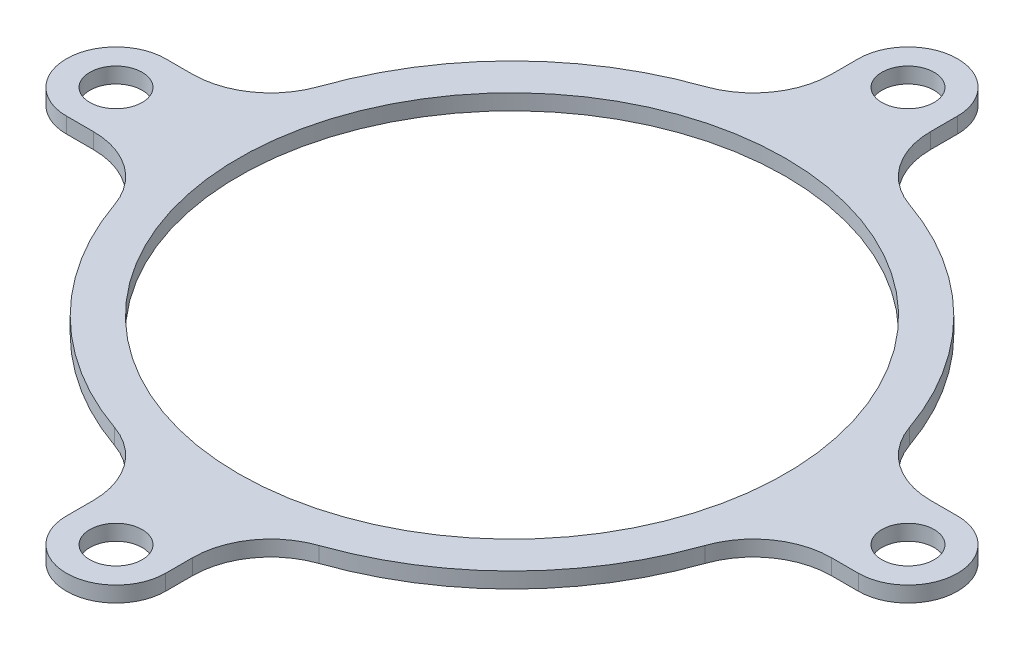
ISO-10303-21;
HEADER;
FILE_DESCRIPTION(('STEP AP214'),'2;1');
FILE_NAME('part.step','',(''),(''),'','','');
FILE_SCHEMA(('AUTOMOTIVE_DESIGN { 1 0 10303 214 1 1 1 1 }'));
ENDSEC;
DATA;
#1=APPLICATION_CONTEXT('core data for automotive mechanical design processes');
#2=APPLICATION_PROTOCOL_DEFINITION('international standard','automotive_design',2000,#1);
#3=PRODUCT_CONTEXT('',#1,'mechanical');
#4=PRODUCT('Part','Part','',(#3));
#5=PRODUCT_RELATED_PRODUCT_CATEGORY('part','',(#4));
#6=PRODUCT_DEFINITION_FORMATION('','',#4);
#7=PRODUCT_DEFINITION_CONTEXT('part definition',#1,'design');
#8=PRODUCT_DEFINITION('design','',#6,#7);
#9=PRODUCT_DEFINITION_SHAPE('','',#8);
#10=(LENGTH_UNIT() NAMED_UNIT(*) SI_UNIT(.MILLI.,.METRE.));
#11=(NAMED_UNIT(*) PLANE_ANGLE_UNIT() SI_UNIT($,.RADIAN.));
#12=(NAMED_UNIT(*) SI_UNIT($,.STERADIAN.) SOLID_ANGLE_UNIT());
#13=UNCERTAINTY_MEASURE_WITH_UNIT(LENGTH_MEASURE(1.E-05),#10,'distance_accuracy_value','');
#14=(GEOMETRIC_REPRESENTATION_CONTEXT(3) GLOBAL_UNCERTAINTY_ASSIGNED_CONTEXT((#13)) GLOBAL_UNIT_ASSIGNED_CONTEXT((#10,
#11,#12)) REPRESENTATION_CONTEXT('',''));
#15=CARTESIAN_POINT('',(0.,0.,0.));
#16=DIRECTION('',(0.,0.,1.));
#17=DIRECTION('',(1.,0.,0.));
#18=AXIS2_PLACEMENT_3D('',#15,#16,#17);
#19=CARTESIAN_POINT('',(0.,1.,0.));
#20=DIRECTION('',(0.,-1.,0.));
#21=DIRECTION('',(0.,0.,-1.));
#22=AXIS2_PLACEMENT_3D('',#19,#20,#21);
#23=CYLINDRICAL_SURFACE('',#22,40.);
#24=DIRECTION('',(0.,1.,0.));
#25=VECTOR('',#24,1.);
#26=CARTESIAN_POINT('',(37.8009735324368,-33.4787718355997,-13.0800000000004));
#27=LINE('',#26,#25);
#28=CARTESIAN_POINT('',(37.8009735324368,-1.,-13.0800000000004));
#29=VERTEX_POINT('',#28);
#30=CARTESIAN_POINT('',(37.8009735324368,1.,-13.0800000000004));
#31=VERTEX_POINT('',#30);
#32=EDGE_CURVE('E236',#29,#31,#27,.T.);
#33=ORIENTED_EDGE('',*,*,#32,.F.);
#34=CARTESIAN_POINT('',(0.,-1.,0.));
#35=DIRECTION('',(0.,1.,0.));
#36=DIRECTION('',(0.,0.,1.));
#37=AXIS2_PLACEMENT_3D('',#34,#35,#36);
#38=CIRCLE('',#37,40.);
#39=CARTESIAN_POINT('',(13.08,-1.,-37.800973532437));
#40=VERTEX_POINT('',#39);
#41=EDGE_CURVE('E386',#29,#40,#38,.T.);
#42=ORIENTED_EDGE('',*,*,#41,.T.);
#43=DIRECTION('',(0.,1.,0.));
#44=VECTOR('',#43,1.);
#45=CARTESIAN_POINT('',(13.08,-33.4787718355997,-37.800973532437));
#46=LINE('',#45,#44);
#47=CARTESIAN_POINT('',(13.08,1.,-37.800973532437));
#48=VERTEX_POINT('',#47);
#49=EDGE_CURVE('E376',#40,#48,#46,.T.);
#50=ORIENTED_EDGE('',*,*,#49,.T.);
#51=CARTESIAN_POINT('',(0.,1.,0.));
#52=DIRECTION('',(0.,1.,0.));
#53=DIRECTION('',(0.,0.,1.));
#54=AXIS2_PLACEMENT_3D('',#51,#52,#53);
#55=CIRCLE('',#54,40.);
#56=EDGE_CURVE('E47',#31,#48,#55,.T.);
#57=ORIENTED_EDGE('',*,*,#56,.F.);
#58=EDGE_LOOP('',(#33,#42,#50,#57));
#59=FACE_BOUND('',#58,.T.);
#60=ADVANCED_FACE('F37',(#59),#23,.T.);
#61=CARTESIAN_POINT('',(13.08,-1.,37.800973532437));
#62=VERTEX_POINT('',#61);
#63=CARTESIAN_POINT('',(37.8009735324371,-1.,13.0799999999996));
#64=VERTEX_POINT('',#63);
#65=EDGE_CURVE('E444',#62,#64,#38,.T.);
#66=ORIENTED_EDGE('',*,*,#65,.T.);
#67=DIRECTION('',(0.,1.,0.));
#68=VECTOR('',#67,1.);
#69=CARTESIAN_POINT('',(37.8009735324371,-33.4787718355997,13.0799999999996));
#70=LINE('',#69,#68);
#71=CARTESIAN_POINT('',(37.8009735324371,1.,13.0799999999996));
#72=VERTEX_POINT('',#71);
#73=EDGE_CURVE('E61',#64,#72,#70,.T.);
#74=ORIENTED_EDGE('',*,*,#73,.T.);
#75=CARTESIAN_POINT('',(13.08,1.,37.800973532437));
#76=VERTEX_POINT('',#75);
#77=EDGE_CURVE('E224',#76,#72,#55,.T.);
#78=ORIENTED_EDGE('',*,*,#77,.F.);
#79=DIRECTION('',(0.,1.,0.));
#80=VECTOR('',#79,1.);
#81=CARTESIAN_POINT('',(13.08,-33.4787718355997,37.800973532437));
#82=LINE('',#81,#80);
#83=EDGE_CURVE('E278',#62,#76,#82,.T.);
#84=ORIENTED_EDGE('',*,*,#83,.F.);
#85=EDGE_LOOP('',(#66,#74,#78,#84));
#86=FACE_BOUND('',#85,.T.);
#87=ADVANCED_FACE('F410',(#86),#23,.T.);
#88=CARTESIAN_POINT('',(-37.8009735324369,-1.,13.0800000000001));
#89=VERTEX_POINT('',#88);
#90=CARTESIAN_POINT('',(-13.08,-1.,37.800973532437));
#91=VERTEX_POINT('',#90);
#92=EDGE_CURVE('E440',#89,#91,#38,.T.);
#93=ORIENTED_EDGE('',*,*,#92,.T.);
#94=DIRECTION('',(0.,1.,0.));
#95=VECTOR('',#94,1.);
#96=CARTESIAN_POINT('',(-13.08,-33.4787718355997,37.800973532437));
#97=LINE('',#96,#95);
#98=CARTESIAN_POINT('',(-13.08,1.,37.800973532437));
#99=VERTEX_POINT('',#98);
#100=EDGE_CURVE('E286',#91,#99,#97,.T.);
#101=ORIENTED_EDGE('',*,*,#100,.T.);
#102=CARTESIAN_POINT('',(-37.8009735324369,1.,13.0800000000001));
#103=VERTEX_POINT('',#102);
#104=EDGE_CURVE('E46',#103,#99,#55,.T.);
#105=ORIENTED_EDGE('',*,*,#104,.F.);
#106=DIRECTION('',(0.,1.,0.));
#107=VECTOR('',#106,1.);
#108=CARTESIAN_POINT('',(-37.8009735324369,-33.4787718355997,13.0800000000001));
#109=LINE('',#108,#107);
#110=EDGE_CURVE('E323',#89,#103,#109,.T.);
#111=ORIENTED_EDGE('',*,*,#110,.F.);
#112=EDGE_LOOP('',(#93,#101,#105,#111));
#113=FACE_BOUND('',#112,.T.);
#114=ADVANCED_FACE('F406',(#113),#23,.T.);
#115=CARTESIAN_POINT('',(0.,1.,0.));
#116=DIRECTION('',(0.,1.,0.));
#117=DIRECTION('',(0.,0.,1.));
#118=AXIS2_PLACEMENT_3D('',#115,#116,#117);
#119=PLANE('',#118);
#120=CARTESIAN_POINT('',(-13.08,1.,-37.800973532437));
#121=VERTEX_POINT('',#120);
#122=CARTESIAN_POINT('',(-37.800973532437,1.,-13.0799999999999));
#123=VERTEX_POINT('',#122);
#124=EDGE_CURVE('E11',#121,#123,#55,.T.);
#125=ORIENTED_EDGE('',*,*,#124,.T.);
#126=CARTESIAN_POINT('',(-47.2512169155463,1.,-16.3499999999998));
#127=DIRECTION('',(0.,-1.,0.));
#128=DIRECTION('',(1.,0.,0.));
#129=AXIS2_PLACEMENT_3D('',#126,#127,#128);
#130=CIRCLE('',#129,10.);
#131=CARTESIAN_POINT('',(-47.2512169155462,1.,-6.34999999999984));
#132=VERTEX_POINT('',#131);
#133=EDGE_CURVE('E311',#123,#132,#130,.T.);
#134=ORIENTED_EDGE('',*,*,#133,.T.);
#135=DIRECTION('',(-1.,0.,0.));
#136=VECTOR('',#135,1.);
#137=CARTESIAN_POINT('',(-50.7,1.,-6.34999999999982));
#138=LINE('',#137,#136);
#139=CARTESIAN_POINT('',(-50.7,1.,-6.34999999999982));
#140=VERTEX_POINT('',#139);
#141=EDGE_CURVE('E314',#132,#140,#138,.T.);
#142=ORIENTED_EDGE('',*,*,#141,.T.);
#143=CARTESIAN_POINT('',(-50.7,1.,1.77018103879347E-13));
#144=DIRECTION('',(0.,1.,0.));
#145=DIRECTION('',(-1.,0.,0.));
#146=AXIS2_PLACEMENT_3D('',#143,#144,#145);
#147=CIRCLE('',#146,6.35);
#148=CARTESIAN_POINT('',(-50.7,1.,6.35000000000018));
#149=VERTEX_POINT('',#148);
#150=EDGE_CURVE('E317',#140,#149,#147,.T.);
#151=ORIENTED_EDGE('',*,*,#150,.T.);
#152=DIRECTION('',(1.,0.,0.));
#153=VECTOR('',#152,1.);
#154=CARTESIAN_POINT('',(-47.2512169155462,1.,6.35000000000016));
#155=LINE('',#154,#153);
#156=CARTESIAN_POINT('',(-47.2512169155462,1.,6.35000000000016));
#157=VERTEX_POINT('',#156);
#158=EDGE_CURVE('E320',#149,#157,#155,.T.);
#159=ORIENTED_EDGE('',*,*,#158,.T.);
#160=CARTESIAN_POINT('',(-47.2512169155462,1.,16.3500000000002));
#161=DIRECTION('',(0.,-1.,0.));
#162=DIRECTION('',(-1.,0.,0.));
#163=AXIS2_PLACEMENT_3D('',#160,#161,#162);
#164=CIRCLE('',#163,10.);
#165=EDGE_CURVE('E308',#157,#103,#164,.T.);
#166=ORIENTED_EDGE('',*,*,#165,.T.);
#167=ORIENTED_EDGE('',*,*,#104,.T.);
#168=CARTESIAN_POINT('',(-16.35,1.,47.2512169155462));
#169=DIRECTION('',(0.,-1.,0.));
#170=DIRECTION('',(0.,0.,-1.));
#171=AXIS2_PLACEMENT_3D('',#168,#169,#170);
#172=CIRCLE('',#171,10.);
#173=CARTESIAN_POINT('',(-6.35,1.,47.2512169155462));
#174=VERTEX_POINT('',#173);
#175=EDGE_CURVE('E266',#99,#174,#172,.T.);
#176=ORIENTED_EDGE('',*,*,#175,.T.);
#177=DIRECTION('',(0.,0.,1.));
#178=VECTOR('',#177,1.);
#179=CARTESIAN_POINT('',(-6.35,1.,50.7));
#180=LINE('',#179,#178);
#181=CARTESIAN_POINT('',(-6.35,1.,50.7));
#182=VERTEX_POINT('',#181);
#183=EDGE_CURVE('E269',#174,#182,#180,.T.);
#184=ORIENTED_EDGE('',*,*,#183,.T.);
#185=CARTESIAN_POINT('',(0.,1.,50.7));
#186=DIRECTION('',(0.,1.,0.));
#187=DIRECTION('',(0.,0.,1.));
#188=AXIS2_PLACEMENT_3D('',#185,#186,#187);
#189=CIRCLE('',#188,6.35);
#190=CARTESIAN_POINT('',(6.35,1.,50.7));
#191=VERTEX_POINT('',#190);
#192=EDGE_CURVE('E272',#182,#191,#189,.T.);
#193=ORIENTED_EDGE('',*,*,#192,.T.);
#194=DIRECTION('',(0.,0.,-1.));
#195=VECTOR('',#194,1.);
#196=CARTESIAN_POINT('',(6.35,1.,47.2512169155462));
#197=LINE('',#196,#195);
#198=CARTESIAN_POINT('',(6.35,1.,47.2512169155462));
#199=VERTEX_POINT('',#198);
#200=EDGE_CURVE('E275',#191,#199,#197,.T.);
#201=ORIENTED_EDGE('',*,*,#200,.T.);
#202=CARTESIAN_POINT('',(16.35,1.,47.2512169155462));
#203=DIRECTION('',(0.,-1.,0.));
#204=DIRECTION('',(0.,0.,1.));
#205=AXIS2_PLACEMENT_3D('',#202,#203,#204);
#206=CIRCLE('',#205,10.);
#207=EDGE_CURVE('E264',#199,#76,#206,.T.);
#208=ORIENTED_EDGE('',*,*,#207,.T.);
#209=ORIENTED_EDGE('',*,*,#77,.T.);
#210=CARTESIAN_POINT('',(47.2512169155464,1.,16.3499999999995));
#211=DIRECTION('',(0.,-1.,0.));
#212=DIRECTION('',(-1.,0.,0.));
#213=AXIS2_PLACEMENT_3D('',#210,#211,#212);
#214=CIRCLE('',#213,10.);
#215=CARTESIAN_POINT('',(47.2512169155463,1.,6.3499999999995));
#216=VERTEX_POINT('',#215);
#217=EDGE_CURVE('E205',#72,#216,#214,.T.);
#218=ORIENTED_EDGE('',*,*,#217,.T.);
#219=DIRECTION('',(1.,0.,0.));
#220=VECTOR('',#219,1.);
#221=CARTESIAN_POINT('',(50.7000000000001,1.,6.34999999999947));
#222=LINE('',#221,#220);
#223=CARTESIAN_POINT('',(50.7000000000001,1.,6.34999999999947));
#224=VERTEX_POINT('',#223);
#225=EDGE_CURVE('E213',#216,#224,#222,.T.);
#226=ORIENTED_EDGE('',*,*,#225,.T.);
#227=CARTESIAN_POINT('',(50.7,1.,-5.31054311638041E-13));
#228=DIRECTION('',(0.,1.,0.));
#229=DIRECTION('',(1.,0.,0.));
#230=AXIS2_PLACEMENT_3D('',#227,#228,#229);
#231=CIRCLE('',#230,6.35);
#232=CARTESIAN_POINT('',(50.6999999999999,1.,-6.35000000000053));
#233=VERTEX_POINT('',#232);
#234=EDGE_CURVE('E219',#224,#233,#231,.T.);
#235=ORIENTED_EDGE('',*,*,#234,.T.);
#236=DIRECTION('',(-1.,0.,0.));
#237=VECTOR('',#236,1.);
#238=CARTESIAN_POINT('',(47.2512169155461,1.,-6.3500000000005));
#239=LINE('',#238,#237);
#240=CARTESIAN_POINT('',(47.2512169155461,1.,-6.3500000000005));
#241=VERTEX_POINT('',#240);
#242=EDGE_CURVE('E233',#233,#241,#239,.T.);
#243=ORIENTED_EDGE('',*,*,#242,.T.);
#244=CARTESIAN_POINT('',(47.251216915546,1.,-16.3500000000005));
#245=DIRECTION('',(0.,-1.,0.));
#246=DIRECTION('',(1.,0.,0.));
#247=AXIS2_PLACEMENT_3D('',#244,#245,#246);
#248=CIRCLE('',#247,10.);
#249=EDGE_CURVE('E225',#241,#31,#248,.T.);
#250=ORIENTED_EDGE('',*,*,#249,.T.);
#251=ORIENTED_EDGE('',*,*,#56,.T.);
#252=CARTESIAN_POINT('',(16.35,1.,-47.2512169155462));
#253=DIRECTION('',(0.,-1.,0.));
#254=DIRECTION('',(0.,0.,1.));
#255=AXIS2_PLACEMENT_3D('',#252,#253,#254);
#256=CIRCLE('',#255,10.);
#257=CARTESIAN_POINT('',(6.35,1.,-47.2512169155462));
#258=VERTEX_POINT('',#257);
#259=EDGE_CURVE('E356',#48,#258,#256,.T.);
#260=ORIENTED_EDGE('',*,*,#259,.T.);
#261=DIRECTION('',(0.,0.,-1.));
#262=VECTOR('',#261,1.);
#263=CARTESIAN_POINT('',(6.35,1.,-50.7));
#264=LINE('',#263,#262);
#265=CARTESIAN_POINT('',(6.35,1.,-50.7));
#266=VERTEX_POINT('',#265);
#267=EDGE_CURVE('E359',#258,#266,#264,.T.);
#268=ORIENTED_EDGE('',*,*,#267,.T.);
#269=CARTESIAN_POINT('',(0.,1.,-50.7));
#270=DIRECTION('',(0.,1.,0.));
#271=DIRECTION('',(0.,0.,-1.));
#272=AXIS2_PLACEMENT_3D('',#269,#270,#271);
#273=CIRCLE('',#272,6.35);
#274=CARTESIAN_POINT('',(-6.35,1.,-50.7));
#275=VERTEX_POINT('',#274);
#276=EDGE_CURVE('E362',#266,#275,#273,.T.);
#277=ORIENTED_EDGE('',*,*,#276,.T.);
#278=DIRECTION('',(0.,0.,1.));
#279=VECTOR('',#278,1.);
#280=CARTESIAN_POINT('',(-6.35,1.,-47.2512169155462));
#281=LINE('',#280,#279);
#282=CARTESIAN_POINT('',(-6.35,1.,-47.2512169155462));
#283=VERTEX_POINT('',#282);
#284=EDGE_CURVE('E365',#275,#283,#281,.T.);
#285=ORIENTED_EDGE('',*,*,#284,.T.);
#286=CARTESIAN_POINT('',(-16.35,1.,-47.2512169155462));
#287=DIRECTION('',(0.,-1.,0.));
#288=DIRECTION('',(0.,0.,-1.));
#289=AXIS2_PLACEMENT_3D('',#286,#287,#288);
#290=CIRCLE('',#289,10.);
#291=EDGE_CURVE('E353',#283,#121,#290,.T.);
#292=ORIENTED_EDGE('',*,*,#291,.T.);
#293=EDGE_LOOP('',(#125,#134,#142,#151,#159,#166,#167,#176,#184,#193,#201,#208,#209,#218,#226,
#235,#243,#250,#251,#260,#268,#277,#285,#292));
#294=FACE_BOUND('',#293,.T.);
#295=CARTESIAN_POINT('',(0.,1.,0.));
#296=DIRECTION('',(0.,1.,0.));
#297=DIRECTION('',(0.,0.,1.));
#298=AXIS2_PLACEMENT_3D('',#295,#296,#297);
#299=CIRCLE('',#298,35.);
#300=CARTESIAN_POINT('',(0.,1.,35.));
#301=VERTEX_POINT('',#300);
#302=EDGE_CURVE('E383',#301,#301,#299,.T.);
#303=ORIENTED_EDGE('',*,*,#302,.F.);
#304=EDGE_LOOP('',(#303));
#305=FACE_BOUND('',#304,.T.);
#306=CARTESIAN_POINT('',(0.,1.,-50.7));
#307=DIRECTION('',(0.,1.,0.));
#308=DIRECTION('',(0.,0.,1.));
#309=AXIS2_PLACEMENT_3D('',#306,#307,#308);
#310=CIRCLE('',#309,3.35);
#311=CARTESIAN_POINT('',(0.,1.,-47.35));
#312=VERTEX_POINT('',#311);
#313=EDGE_CURVE('E337',#312,#312,#310,.T.);
#314=ORIENTED_EDGE('',*,*,#313,.F.);
#315=EDGE_LOOP('',(#314));
#316=FACE_BOUND('',#315,.T.);
#317=CARTESIAN_POINT('',(-50.7,1.,1.77018103879347E-13));
#318=DIRECTION('',(0.,1.,0.));
#319=DIRECTION('',(1.,0.,0.));
#320=AXIS2_PLACEMENT_3D('',#317,#318,#319);
#321=CIRCLE('',#320,3.35);
#322=CARTESIAN_POINT('',(-47.35,1.,1.65321641394222E-13));
#323=VERTEX_POINT('',#322);
#324=EDGE_CURVE('E292',#323,#323,#321,.T.);
#325=ORIENTED_EDGE('',*,*,#324,.F.);
#326=EDGE_LOOP('',(#325));
#327=FACE_BOUND('',#326,.T.);
#328=CARTESIAN_POINT('',(0.,1.,50.7));
#329=DIRECTION('',(0.,1.,0.));
#330=DIRECTION('',(0.,0.,-1.));
#331=AXIS2_PLACEMENT_3D('',#328,#329,#330);
#332=CIRCLE('',#331,3.35);
#333=CARTESIAN_POINT('',(0.,1.,47.35));
#334=VERTEX_POINT('',#333);
#335=EDGE_CURVE('E247',#334,#334,#332,.T.);
#336=ORIENTED_EDGE('',*,*,#335,.F.);
#337=EDGE_LOOP('',(#336));
#338=FACE_BOUND('',#337,.T.);
#339=CARTESIAN_POINT('',(50.7,1.,-5.31054311638041E-13));
#340=DIRECTION('',(0.,1.,0.));
#341=DIRECTION('',(-1.,0.,0.));
#342=AXIS2_PLACEMENT_3D('',#339,#340,#341);
#343=CIRCLE('',#342,3.35);
#344=CARTESIAN_POINT('',(47.35,1.,-4.95964924182667E-13));
#345=VERTEX_POINT('',#344);
#346=EDGE_CURVE('E228',#345,#345,#343,.T.);
#347=ORIENTED_EDGE('',*,*,#346,.F.);
#348=EDGE_LOOP('',(#347));
#349=FACE_BOUND('',#348,.T.);
#350=ADVANCED_FACE('F221',(#294,#305,#316,#327,#338,#349),#119,.T.);
#351=CARTESIAN_POINT('',(0.,-1.,0.));
#352=DIRECTION('',(0.,1.,0.));
#353=DIRECTION('',(0.,0.,1.));
#354=AXIS2_PLACEMENT_3D('',#351,#352,#353);
#355=PLANE('',#354);
#356=CARTESIAN_POINT('',(-13.08,-1.,-37.800973532437));
#357=VERTEX_POINT('',#356);
#358=CARTESIAN_POINT('',(-37.800973532437,-1.,-13.0799999999999));
#359=VERTEX_POINT('',#358);
#360=EDGE_CURVE('E41',#357,#359,#38,.T.);
#361=ORIENTED_EDGE('',*,*,#360,.F.);
#362=CARTESIAN_POINT('',(-16.35,-1.,-47.2512169155462));
#363=DIRECTION('',(0.,1.,0.));
#364=DIRECTION('',(0.,0.,1.));
#365=AXIS2_PLACEMENT_3D('',#362,#363,#364);
#366=CIRCLE('',#365,10.);
#367=CARTESIAN_POINT('',(-6.35,-1.,-47.2512169155462));
#368=VERTEX_POINT('',#367);
#369=EDGE_CURVE('E348',#357,#368,#366,.T.);
#370=ORIENTED_EDGE('',*,*,#369,.T.);
#371=DIRECTION('',(0.,0.,-1.));
#372=VECTOR('',#371,1.);
#373=CARTESIAN_POINT('',(-6.35,-1.,-47.2512169155462));
#374=LINE('',#373,#372);
#375=CARTESIAN_POINT('',(-6.35,-1.,-50.7));
#376=VERTEX_POINT('',#375);
#377=EDGE_CURVE('E346',#368,#376,#374,.T.);
#378=ORIENTED_EDGE('',*,*,#377,.T.);
#379=CARTESIAN_POINT('',(0.,-1.,-50.7));
#380=DIRECTION('',(0.,1.,0.));
#381=DIRECTION('',(0.,0.,1.));
#382=AXIS2_PLACEMENT_3D('',#379,#380,#381);
#383=CIRCLE('',#382,6.35);
#384=CARTESIAN_POINT('',(6.35,-1.,-50.7));
#385=VERTEX_POINT('',#384);
#386=EDGE_CURVE('E344',#376,#385,#383,.F.);
#387=ORIENTED_EDGE('',*,*,#386,.T.);
#388=DIRECTION('',(0.,0.,1.));
#389=VECTOR('',#388,1.);
#390=CARTESIAN_POINT('',(6.35,-1.,-50.7));
#391=LINE('',#390,#389);
#392=CARTESIAN_POINT('',(6.35,-1.,-47.2512169155462));
#393=VERTEX_POINT('',#392);
#394=EDGE_CURVE('E341',#385,#393,#391,.T.);
#395=ORIENTED_EDGE('',*,*,#394,.T.);
#396=CARTESIAN_POINT('',(16.35,-1.,-47.2512169155462));
#397=DIRECTION('',(0.,1.,0.));
#398=DIRECTION('',(0.,0.,1.));
#399=AXIS2_PLACEMENT_3D('',#396,#397,#398);
#400=CIRCLE('',#399,10.);
#401=EDGE_CURVE('E338',#393,#40,#400,.T.);
#402=ORIENTED_EDGE('',*,*,#401,.T.);
#403=ORIENTED_EDGE('',*,*,#41,.F.);
#404=CARTESIAN_POINT('',(47.251216915546,-1.,-16.3500000000005));
#405=DIRECTION('',(0.,1.,0.));
#406=DIRECTION('',(0.,0.,1.));
#407=AXIS2_PLACEMENT_3D('',#404,#405,#406);
#408=CIRCLE('',#407,10.);
#409=CARTESIAN_POINT('',(47.2512169155461,-1.,-6.3500000000005));
#410=VERTEX_POINT('',#409);
#411=EDGE_CURVE('E248',#29,#410,#408,.T.);
#412=ORIENTED_EDGE('',*,*,#411,.T.);
#413=DIRECTION('',(1.,0.,0.));
#414=VECTOR('',#413,1.);
#415=CARTESIAN_POINT('',(47.2512169155461,-1.,-6.3500000000005));
#416=LINE('',#415,#414);
#417=CARTESIAN_POINT('',(50.6999999999999,-1.,-6.35000000000053));
#418=VERTEX_POINT('',#417);
#419=EDGE_CURVE('E421',#410,#418,#416,.T.);
#420=ORIENTED_EDGE('',*,*,#419,.T.);
#421=CARTESIAN_POINT('',(50.7,-1.,-5.31054311638041E-13));
#422=DIRECTION('',(0.,1.,0.));
#423=DIRECTION('',(0.,0.,1.));
#424=AXIS2_PLACEMENT_3D('',#421,#422,#423);
#425=CIRCLE('',#424,6.35);
#426=CARTESIAN_POINT('',(50.7000000000001,-1.,6.34999999999947));
#427=VERTEX_POINT('',#426);
#428=EDGE_CURVE('E423',#418,#427,#425,.F.);
#429=ORIENTED_EDGE('',*,*,#428,.T.);
#430=DIRECTION('',(-1.,0.,0.));
#431=VECTOR('',#430,1.);
#432=CARTESIAN_POINT('',(50.7000000000001,-1.,6.34999999999947));
#433=LINE('',#432,#431);
#434=CARTESIAN_POINT('',(47.2512169155463,-1.,6.3499999999995));
#435=VERTEX_POINT('',#434);
#436=EDGE_CURVE('E456',#427,#435,#433,.T.);
#437=ORIENTED_EDGE('',*,*,#436,.T.);
#438=CARTESIAN_POINT('',(47.2512169155464,-1.,16.3499999999995));
#439=DIRECTION('',(0.,1.,0.));
#440=DIRECTION('',(0.,0.,1.));
#441=AXIS2_PLACEMENT_3D('',#438,#439,#440);
#442=CIRCLE('',#441,10.);
#443=EDGE_CURVE('E207',#435,#64,#442,.T.);
#444=ORIENTED_EDGE('',*,*,#443,.T.);
#445=ORIENTED_EDGE('',*,*,#65,.F.);
#446=CARTESIAN_POINT('',(16.35,-1.,47.2512169155462));
#447=DIRECTION('',(0.,1.,0.));
#448=DIRECTION('',(0.,0.,1.));
#449=AXIS2_PLACEMENT_3D('',#446,#447,#448);
#450=CIRCLE('',#449,10.);
#451=CARTESIAN_POINT('',(6.35,-1.,47.2512169155462));
#452=VERTEX_POINT('',#451);
#453=EDGE_CURVE('E259',#62,#452,#450,.T.);
#454=ORIENTED_EDGE('',*,*,#453,.T.);
#455=DIRECTION('',(0.,0.,1.));
#456=VECTOR('',#455,1.);
#457=CARTESIAN_POINT('',(6.35,-1.,47.2512169155462));
#458=LINE('',#457,#456);
#459=CARTESIAN_POINT('',(6.35,-1.,50.7));
#460=VERTEX_POINT('',#459);
#461=EDGE_CURVE('E257',#452,#460,#458,.T.);
#462=ORIENTED_EDGE('',*,*,#461,.T.);
#463=CARTESIAN_POINT('',(0.,-1.,50.7));
#464=DIRECTION('',(0.,1.,0.));
#465=DIRECTION('',(0.,0.,1.));
#466=AXIS2_PLACEMENT_3D('',#463,#464,#465);
#467=CIRCLE('',#466,6.35);
#468=CARTESIAN_POINT('',(-6.35,-1.,50.7));
#469=VERTEX_POINT('',#468);
#470=EDGE_CURVE('E255',#460,#469,#467,.F.);
#471=ORIENTED_EDGE('',*,*,#470,.T.);
#472=DIRECTION('',(0.,0.,-1.));
#473=VECTOR('',#472,1.);
#474=CARTESIAN_POINT('',(-6.35,-1.,50.7));
#475=LINE('',#474,#473);
#476=CARTESIAN_POINT('',(-6.35,-1.,47.2512169155462));
#477=VERTEX_POINT('',#476);
#478=EDGE_CURVE('E252',#469,#477,#475,.T.);
#479=ORIENTED_EDGE('',*,*,#478,.T.);
#480=CARTESIAN_POINT('',(-16.35,-1.,47.2512169155462));
#481=DIRECTION('',(0.,1.,0.));
#482=DIRECTION('',(0.,0.,1.));
#483=AXIS2_PLACEMENT_3D('',#480,#481,#482);
#484=CIRCLE('',#483,10.);
#485=EDGE_CURVE('E249',#477,#91,#484,.T.);
#486=ORIENTED_EDGE('',*,*,#485,.T.);
#487=ORIENTED_EDGE('',*,*,#92,.F.);
#488=CARTESIAN_POINT('',(-47.2512169155462,-1.,16.3500000000002));
#489=DIRECTION('',(0.,1.,0.));
#490=DIRECTION('',(0.,0.,1.));
#491=AXIS2_PLACEMENT_3D('',#488,#489,#490);
#492=CIRCLE('',#491,10.);
#493=CARTESIAN_POINT('',(-47.2512169155462,-1.,6.35000000000016));
#494=VERTEX_POINT('',#493);
#495=EDGE_CURVE('E303',#89,#494,#492,.T.);
#496=ORIENTED_EDGE('',*,*,#495,.T.);
#497=DIRECTION('',(-1.,0.,0.));
#498=VECTOR('',#497,1.);
#499=CARTESIAN_POINT('',(-47.2512169155462,-1.,6.35000000000016));
#500=LINE('',#499,#498);
#501=CARTESIAN_POINT('',(-50.7,-1.,6.35000000000018));
#502=VERTEX_POINT('',#501);
#503=EDGE_CURVE('E301',#494,#502,#500,.T.);
#504=ORIENTED_EDGE('',*,*,#503,.T.);
#505=CARTESIAN_POINT('',(-50.7,-1.,1.77018103879347E-13));
#506=DIRECTION('',(0.,1.,0.));
#507=DIRECTION('',(0.,0.,1.));
#508=AXIS2_PLACEMENT_3D('',#505,#506,#507);
#509=CIRCLE('',#508,6.35);
#510=CARTESIAN_POINT('',(-50.7,-1.,-6.34999999999982));
#511=VERTEX_POINT('',#510);
#512=EDGE_CURVE('E299',#502,#511,#509,.F.);
#513=ORIENTED_EDGE('',*,*,#512,.T.);
#514=DIRECTION('',(1.,0.,0.));
#515=VECTOR('',#514,1.);
#516=CARTESIAN_POINT('',(-50.7,-1.,-6.34999999999982));
#517=LINE('',#516,#515);
#518=CARTESIAN_POINT('',(-47.2512169155463,-1.,-6.34999999999983));
#519=VERTEX_POINT('',#518);
#520=EDGE_CURVE('E296',#511,#519,#517,.T.);
#521=ORIENTED_EDGE('',*,*,#520,.T.);
#522=CARTESIAN_POINT('',(-47.2512169155463,-1.,-16.3499999999998));
#523=DIRECTION('',(0.,1.,0.));
#524=DIRECTION('',(0.,0.,1.));
#525=AXIS2_PLACEMENT_3D('',#522,#523,#524);
#526=CIRCLE('',#525,10.);
#527=EDGE_CURVE('E293',#519,#359,#526,.T.);
#528=ORIENTED_EDGE('',*,*,#527,.T.);
#529=EDGE_LOOP('',(#361,#370,#378,#387,#395,#402,#403,#412,#420,#429,#437,#444,#445,#454,#462,
#471,#479,#486,#487,#496,#504,#513,#521,#528));
#530=FACE_BOUND('',#529,.T.);
#531=CARTESIAN_POINT('',(0.,-1.,0.));
#532=DIRECTION('',(0.,1.,0.));
#533=DIRECTION('',(0.,0.,1.));
#534=AXIS2_PLACEMENT_3D('',#531,#532,#533);
#535=CIRCLE('',#534,35.);
#536=CARTESIAN_POINT('',(0.,-1.,35.));
#537=VERTEX_POINT('',#536);
#538=EDGE_CURVE('E382',#537,#537,#535,.T.);
#539=ORIENTED_EDGE('',*,*,#538,.T.);
#540=EDGE_LOOP('',(#539));
#541=FACE_BOUND('',#540,.T.);
#542=CARTESIAN_POINT('',(0.,-1.,-50.7));
#543=DIRECTION('',(0.,1.,0.));
#544=DIRECTION('',(0.,0.,1.));
#545=AXIS2_PLACEMENT_3D('',#542,#543,#544);
#546=CIRCLE('',#545,3.35);
#547=CARTESIAN_POINT('',(0.,-1.,-47.35));
#548=VERTEX_POINT('',#547);
#549=EDGE_CURVE('E350',#548,#548,#546,.F.);
#550=ORIENTED_EDGE('',*,*,#549,.F.);
#551=EDGE_LOOP('',(#550));
#552=FACE_BOUND('',#551,.T.);
#553=CARTESIAN_POINT('',(-50.7,-1.,1.77018103879347E-13));
#554=DIRECTION('',(0.,1.,0.));
#555=DIRECTION('',(0.,0.,1.));
#556=AXIS2_PLACEMENT_3D('',#553,#554,#555);
#557=CIRCLE('',#556,3.35);
#558=CARTESIAN_POINT('',(-50.7,-1.,3.35000000000018));
#559=VERTEX_POINT('',#558);
#560=EDGE_CURVE('E305',#559,#559,#557,.F.);
#561=ORIENTED_EDGE('',*,*,#560,.F.);
#562=EDGE_LOOP('',(#561));
#563=FACE_BOUND('',#562,.T.);
#564=CARTESIAN_POINT('',(0.,-1.,50.7));
#565=DIRECTION('',(0.,1.,0.));
#566=DIRECTION('',(0.,0.,1.));
#567=AXIS2_PLACEMENT_3D('',#564,#565,#566);
#568=CIRCLE('',#567,3.35);
#569=CARTESIAN_POINT('',(0.,-1.,54.05));
#570=VERTEX_POINT('',#569);
#571=EDGE_CURVE('E261',#570,#570,#568,.F.);
#572=ORIENTED_EDGE('',*,*,#571,.F.);
#573=EDGE_LOOP('',(#572));
#574=FACE_BOUND('',#573,.T.);
#575=CARTESIAN_POINT('',(50.7,-1.,-5.31054311638041E-13));
#576=DIRECTION('',(0.,1.,0.));
#577=DIRECTION('',(0.,0.,1.));
#578=AXIS2_PLACEMENT_3D('',#575,#576,#577);
#579=CIRCLE('',#578,3.35);
#580=CARTESIAN_POINT('',(50.7,-1.,3.34999999999947));
#581=VERTEX_POINT('',#580);
#582=EDGE_CURVE('E244',#581,#581,#579,.F.);
#583=ORIENTED_EDGE('',*,*,#582,.F.);
#584=EDGE_LOOP('',(#583));
#585=FACE_BOUND('',#584,.T.);
#586=ADVANCED_FACE('F390',(#530,#541,#552,#563,#574,#585),#355,.F.);
#587=ORIENTED_EDGE('',*,*,#360,.T.);
#588=DIRECTION('',(0.,1.,0.));
#589=VECTOR('',#588,1.);
#590=CARTESIAN_POINT('',(-37.800973532437,-33.4787718355997,-13.0799999999999));
#591=LINE('',#590,#589);
#592=EDGE_CURVE('E331',#359,#123,#591,.T.);
#593=ORIENTED_EDGE('',*,*,#592,.T.);
#594=ORIENTED_EDGE('',*,*,#124,.F.);
#595=DIRECTION('',(0.,1.,0.));
#596=VECTOR('',#595,1.);
#597=CARTESIAN_POINT('',(-13.08,-33.4787718355997,-37.800973532437));
#598=LINE('',#597,#596);
#599=EDGE_CURVE('E368',#357,#121,#598,.T.);
#600=ORIENTED_EDGE('',*,*,#599,.F.);
#601=EDGE_LOOP('',(#587,#593,#594,#600));
#602=FACE_BOUND('',#601,.T.);
#603=ADVANCED_FACE('F39',(#602),#23,.T.);
#604=CARTESIAN_POINT('',(0.,1.,0.));
#605=DIRECTION('',(0.,-1.,0.));
#606=DIRECTION('',(0.,0.,-1.));
#607=AXIS2_PLACEMENT_3D('',#604,#605,#606);
#608=CYLINDRICAL_SURFACE('',#607,35.);
#609=ORIENTED_EDGE('',*,*,#302,.T.);
#610=EDGE_LOOP('',(#609));
#611=FACE_BOUND('',#610,.T.);
#612=ORIENTED_EDGE('',*,*,#538,.F.);
#613=EDGE_LOOP('',(#612));
#614=FACE_BOUND('',#613,.T.);
#615=ADVANCED_FACE('F393',(#611,#614),#608,.F.);
#616=CARTESIAN_POINT('',(16.35,-33.4787718355997,-47.2512169155462));
#617=DIRECTION('',(0.,1.,0.));
#618=DIRECTION('',(0.,0.,1.));
#619=AXIS2_PLACEMENT_3D('',#616,#617,#618);
#620=CYLINDRICAL_SURFACE('',#619,10.);
#621=ORIENTED_EDGE('',*,*,#401,.F.);
#622=DIRECTION('',(0.,1.,0.));
#623=VECTOR('',#622,1.);
#624=CARTESIAN_POINT('',(6.35,-33.4787718355997,-47.2512169155462));
#625=LINE('',#624,#623);
#626=EDGE_CURVE('E374',#393,#258,#625,.T.);
#627=ORIENTED_EDGE('',*,*,#626,.T.);
#628=ORIENTED_EDGE('',*,*,#259,.F.);
#629=ORIENTED_EDGE('',*,*,#49,.F.);
#630=EDGE_LOOP('',(#621,#627,#628,#629));
#631=FACE_BOUND('',#630,.T.);
#632=ADVANCED_FACE('F395',(#631),#620,.F.);
#633=CARTESIAN_POINT('',(6.35,-33.4787718355997,-50.7));
#634=DIRECTION('',(1.,0.,0.));
#635=DIRECTION('',(0.,0.,-1.));
#636=AXIS2_PLACEMENT_3D('',#633,#634,#635);
#637=PLANE('',#636);
#638=ORIENTED_EDGE('',*,*,#394,.F.);
#639=DIRECTION('',(0.,1.,0.));
#640=VECTOR('',#639,1.);
#641=CARTESIAN_POINT('',(6.35,-33.4787718355997,-50.7));
#642=LINE('',#641,#640);
#643=EDGE_CURVE('E372',#385,#266,#642,.T.);
#644=ORIENTED_EDGE('',*,*,#643,.T.);
#645=ORIENTED_EDGE('',*,*,#267,.F.);
#646=ORIENTED_EDGE('',*,*,#626,.F.);
#647=EDGE_LOOP('',(#638,#644,#645,#646));
#648=FACE_BOUND('',#647,.T.);
#649=ADVANCED_FACE('F402',(#648),#637,.T.);
#650=CARTESIAN_POINT('',(0.,-33.4787718355997,-50.7));
#651=DIRECTION('',(0.,1.,0.));
#652=DIRECTION('',(0.,0.,1.));
#653=AXIS2_PLACEMENT_3D('',#650,#651,#652);
#654=CYLINDRICAL_SURFACE('',#653,6.35);
#655=ORIENTED_EDGE('',*,*,#386,.F.);
#656=DIRECTION('',(0.,1.,0.));
#657=VECTOR('',#656,1.);
#658=CARTESIAN_POINT('',(-6.35,-33.4787718355997,-50.7));
#659=LINE('',#658,#657);
#660=EDGE_CURVE('E370',#376,#275,#659,.T.);
#661=ORIENTED_EDGE('',*,*,#660,.T.);
#662=ORIENTED_EDGE('',*,*,#276,.F.);
#663=ORIENTED_EDGE('',*,*,#643,.F.);
#664=EDGE_LOOP('',(#655,#661,#662,#663));
#665=FACE_BOUND('',#664,.T.);
#666=ADVANCED_FACE('F534',(#665),#654,.T.);
#667=CARTESIAN_POINT('',(-6.35,-33.4787718355997,-47.2512169155462));
#668=DIRECTION('',(-1.,0.,0.));
#669=DIRECTION('',(0.,0.,1.));
#670=AXIS2_PLACEMENT_3D('',#667,#668,#669);
#671=PLANE('',#670);
#672=ORIENTED_EDGE('',*,*,#377,.F.);
#673=DIRECTION('',(0.,1.,0.));
#674=VECTOR('',#673,1.);
#675=CARTESIAN_POINT('',(-6.35,-33.4787718355997,-47.2512169155462));
#676=LINE('',#675,#674);
#677=EDGE_CURVE('E342',#368,#283,#676,.T.);
#678=ORIENTED_EDGE('',*,*,#677,.T.);
#679=ORIENTED_EDGE('',*,*,#284,.F.);
#680=ORIENTED_EDGE('',*,*,#660,.F.);
#681=EDGE_LOOP('',(#672,#678,#679,#680));
#682=FACE_BOUND('',#681,.T.);
#683=ADVANCED_FACE('F531',(#682),#671,.T.);
#684=CARTESIAN_POINT('',(-16.35,-33.4787718355997,-47.2512169155462));
#685=DIRECTION('',(0.,1.,0.));
#686=DIRECTION('',(0.,0.,1.));
#687=AXIS2_PLACEMENT_3D('',#684,#685,#686);
#688=CYLINDRICAL_SURFACE('',#687,10.);
#689=ORIENTED_EDGE('',*,*,#369,.F.);
#690=ORIENTED_EDGE('',*,*,#599,.T.);
#691=ORIENTED_EDGE('',*,*,#291,.F.);
#692=ORIENTED_EDGE('',*,*,#677,.F.);
#693=EDGE_LOOP('',(#689,#690,#691,#692));
#694=FACE_BOUND('',#693,.T.);
#695=ADVANCED_FACE('F529',(#694),#688,.F.);
#696=CARTESIAN_POINT('',(0.,-33.4787718355997,-50.7));
#697=DIRECTION('',(0.,1.,0.));
#698=DIRECTION('',(0.,0.,1.));
#699=AXIS2_PLACEMENT_3D('',#696,#697,#698);
#700=CYLINDRICAL_SURFACE('',#699,3.35);
#701=ORIENTED_EDGE('',*,*,#549,.T.);
#702=EDGE_LOOP('',(#701));
#703=FACE_BOUND('',#702,.T.);
#704=ORIENTED_EDGE('',*,*,#313,.T.);
#705=EDGE_LOOP('',(#704));
#706=FACE_BOUND('',#705,.T.);
#707=ADVANCED_FACE('F522',(#703,#706),#700,.F.);
#708=CARTESIAN_POINT('',(-47.2512169155463,-33.4787718355997,-16.3499999999998));
#709=DIRECTION('',(0.,1.,0.));
#710=DIRECTION('',(0.,0.,1.));
#711=AXIS2_PLACEMENT_3D('',#708,#709,#710);
#712=CYLINDRICAL_SURFACE('',#711,10.);
#713=ORIENTED_EDGE('',*,*,#527,.F.);
#714=DIRECTION('',(0.,1.,0.));
#715=VECTOR('',#714,1.);
#716=CARTESIAN_POINT('',(-47.2512169155462,-33.4787718355997,-6.34999999999984));
#717=LINE('',#716,#715);
#718=EDGE_CURVE('E329',#519,#132,#717,.T.);
#719=ORIENTED_EDGE('',*,*,#718,.T.);
#720=ORIENTED_EDGE('',*,*,#133,.F.);
#721=ORIENTED_EDGE('',*,*,#592,.F.);
#722=EDGE_LOOP('',(#713,#719,#720,#721));
#723=FACE_BOUND('',#722,.T.);
#724=ADVANCED_FACE('F518',(#723),#712,.F.);
#725=CARTESIAN_POINT('',(-50.7,-33.4787718355997,-6.34999999999982));
#726=DIRECTION('',(0.,0.,-1.));
#727=DIRECTION('',(-1.,0.,0.));
#728=AXIS2_PLACEMENT_3D('',#725,#726,#727);
#729=PLANE('',#728);
#730=ORIENTED_EDGE('',*,*,#520,.F.);
#731=DIRECTION('',(0.,1.,0.));
#732=VECTOR('',#731,1.);
#733=CARTESIAN_POINT('',(-50.7,-33.4787718355997,-6.34999999999982));
#734=LINE('',#733,#732);
#735=EDGE_CURVE('E327',#511,#140,#734,.T.);
#736=ORIENTED_EDGE('',*,*,#735,.T.);
#737=ORIENTED_EDGE('',*,*,#141,.F.);
#738=ORIENTED_EDGE('',*,*,#718,.F.);
#739=EDGE_LOOP('',(#730,#736,#737,#738));
#740=FACE_BOUND('',#739,.T.);
#741=ADVANCED_FACE('F514',(#740),#729,.T.);
#742=CARTESIAN_POINT('',(-50.7,-33.4787718355997,1.77018103879347E-13));
#743=DIRECTION('',(0.,1.,0.));
#744=DIRECTION('',(0.,0.,1.));
#745=AXIS2_PLACEMENT_3D('',#742,#743,#744);
#746=CYLINDRICAL_SURFACE('',#745,6.35);
#747=ORIENTED_EDGE('',*,*,#512,.F.);
#748=DIRECTION('',(0.,1.,0.));
#749=VECTOR('',#748,1.);
#750=CARTESIAN_POINT('',(-50.7,-33.4787718355997,6.35000000000018));
#751=LINE('',#750,#749);
#752=EDGE_CURVE('E325',#502,#149,#751,.T.);
#753=ORIENTED_EDGE('',*,*,#752,.T.);
#754=ORIENTED_EDGE('',*,*,#150,.F.);
#755=ORIENTED_EDGE('',*,*,#735,.F.);
#756=EDGE_LOOP('',(#747,#753,#754,#755));
#757=FACE_BOUND('',#756,.T.);
#758=ADVANCED_FACE('F510',(#757),#746,.T.);
#759=CARTESIAN_POINT('',(-47.2512169155462,-33.4787718355997,6.35000000000016));
#760=DIRECTION('',(0.,0.,1.));
#761=DIRECTION('',(1.,0.,0.));
#762=AXIS2_PLACEMENT_3D('',#759,#760,#761);
#763=PLANE('',#762);
#764=ORIENTED_EDGE('',*,*,#503,.F.);
#765=DIRECTION('',(0.,1.,0.));
#766=VECTOR('',#765,1.);
#767=CARTESIAN_POINT('',(-47.2512169155462,-33.4787718355997,6.35000000000016));
#768=LINE('',#767,#766);
#769=EDGE_CURVE('E297',#494,#157,#768,.T.);
#770=ORIENTED_EDGE('',*,*,#769,.T.);
#771=ORIENTED_EDGE('',*,*,#158,.F.);
#772=ORIENTED_EDGE('',*,*,#752,.F.);
#773=EDGE_LOOP('',(#764,#770,#771,#772));
#774=FACE_BOUND('',#773,.T.);
#775=ADVANCED_FACE('F507',(#774),#763,.T.);
#776=CARTESIAN_POINT('',(-47.2512169155462,-33.4787718355997,16.3500000000002));
#777=DIRECTION('',(0.,1.,0.));
#778=DIRECTION('',(0.,0.,1.));
#779=AXIS2_PLACEMENT_3D('',#776,#777,#778);
#780=CYLINDRICAL_SURFACE('',#779,10.);
#781=ORIENTED_EDGE('',*,*,#495,.F.);
#782=ORIENTED_EDGE('',*,*,#110,.T.);
#783=ORIENTED_EDGE('',*,*,#165,.F.);
#784=ORIENTED_EDGE('',*,*,#769,.F.);
#785=EDGE_LOOP('',(#781,#782,#783,#784));
#786=FACE_BOUND('',#785,.T.);
#787=ADVANCED_FACE('F505',(#786),#780,.F.);
#788=CARTESIAN_POINT('',(-50.7,-33.4787718355997,1.77018103879347E-13));
#789=DIRECTION('',(0.,1.,0.));
#790=DIRECTION('',(0.,0.,1.));
#791=AXIS2_PLACEMENT_3D('',#788,#789,#790);
#792=CYLINDRICAL_SURFACE('',#791,3.35);
#793=ORIENTED_EDGE('',*,*,#560,.T.);
#794=EDGE_LOOP('',(#793));
#795=FACE_BOUND('',#794,.T.);
#796=ORIENTED_EDGE('',*,*,#324,.T.);
#797=EDGE_LOOP('',(#796));
#798=FACE_BOUND('',#797,.T.);
#799=ADVANCED_FACE('F499',(#795,#798),#792,.F.);
#800=CARTESIAN_POINT('',(-16.35,-33.4787718355997,47.2512169155462));
#801=DIRECTION('',(0.,1.,0.));
#802=DIRECTION('',(0.,0.,1.));
#803=AXIS2_PLACEMENT_3D('',#800,#801,#802);
#804=CYLINDRICAL_SURFACE('',#803,10.);
#805=ORIENTED_EDGE('',*,*,#485,.F.);
#806=DIRECTION('',(0.,1.,0.));
#807=VECTOR('',#806,1.);
#808=CARTESIAN_POINT('',(-6.35,-33.4787718355997,47.2512169155462));
#809=LINE('',#808,#807);
#810=EDGE_CURVE('E284',#477,#174,#809,.T.);
#811=ORIENTED_EDGE('',*,*,#810,.T.);
#812=ORIENTED_EDGE('',*,*,#175,.F.);
#813=ORIENTED_EDGE('',*,*,#100,.F.);
#814=EDGE_LOOP('',(#805,#811,#812,#813));
#815=FACE_BOUND('',#814,.T.);
#816=ADVANCED_FACE('F450',(#815),#804,.F.);
#817=CARTESIAN_POINT('',(-6.35,-33.4787718355997,50.7));
#818=DIRECTION('',(-1.,0.,0.));
#819=DIRECTION('',(0.,0.,1.));
#820=AXIS2_PLACEMENT_3D('',#817,#818,#819);
#821=PLANE('',#820);
#822=ORIENTED_EDGE('',*,*,#478,.F.);
#823=DIRECTION('',(0.,1.,0.));
#824=VECTOR('',#823,1.);
#825=CARTESIAN_POINT('',(-6.35,-33.4787718355997,50.7));
#826=LINE('',#825,#824);
#827=EDGE_CURVE('E282',#469,#182,#826,.T.);
#828=ORIENTED_EDGE('',*,*,#827,.T.);
#829=ORIENTED_EDGE('',*,*,#183,.F.);
#830=ORIENTED_EDGE('',*,*,#810,.F.);
#831=EDGE_LOOP('',(#822,#828,#829,#830));
#832=FACE_BOUND('',#831,.T.);
#833=ADVANCED_FACE('F492',(#832),#821,.T.);
#834=CARTESIAN_POINT('',(0.,-33.4787718355997,50.7));
#835=DIRECTION('',(0.,1.,0.));
#836=DIRECTION('',(0.,0.,1.));
#837=AXIS2_PLACEMENT_3D('',#834,#835,#836);
#838=CYLINDRICAL_SURFACE('',#837,6.35);
#839=ORIENTED_EDGE('',*,*,#470,.F.);
#840=DIRECTION('',(0.,1.,0.));
#841=VECTOR('',#840,1.);
#842=CARTESIAN_POINT('',(6.35,-33.4787718355997,50.7));
#843=LINE('',#842,#841);
#844=EDGE_CURVE('E280',#460,#191,#843,.T.);
#845=ORIENTED_EDGE('',*,*,#844,.T.);
#846=ORIENTED_EDGE('',*,*,#192,.F.);
#847=ORIENTED_EDGE('',*,*,#827,.F.);
#848=EDGE_LOOP('',(#839,#845,#846,#847));
#849=FACE_BOUND('',#848,.T.);
#850=ADVANCED_FACE('F488',(#849),#838,.T.);
#851=CARTESIAN_POINT('',(6.35,-33.4787718355997,47.2512169155462));
#852=DIRECTION('',(1.,0.,0.));
#853=DIRECTION('',(0.,0.,-1.));
#854=AXIS2_PLACEMENT_3D('',#851,#852,#853);
#855=PLANE('',#854);
#856=ORIENTED_EDGE('',*,*,#461,.F.);
#857=DIRECTION('',(0.,1.,0.));
#858=VECTOR('',#857,1.);
#859=CARTESIAN_POINT('',(6.35,-33.4787718355997,47.2512169155462));
#860=LINE('',#859,#858);
#861=EDGE_CURVE('E253',#452,#199,#860,.T.);
#862=ORIENTED_EDGE('',*,*,#861,.T.);
#863=ORIENTED_EDGE('',*,*,#200,.F.);
#864=ORIENTED_EDGE('',*,*,#844,.F.);
#865=EDGE_LOOP('',(#856,#862,#863,#864));
#866=FACE_BOUND('',#865,.T.);
#867=ADVANCED_FACE('F485',(#866),#855,.T.);
#868=CARTESIAN_POINT('',(16.35,-33.4787718355997,47.2512169155462));
#869=DIRECTION('',(0.,1.,0.));
#870=DIRECTION('',(0.,0.,1.));
#871=AXIS2_PLACEMENT_3D('',#868,#869,#870);
#872=CYLINDRICAL_SURFACE('',#871,10.);
#873=ORIENTED_EDGE('',*,*,#453,.F.);
#874=ORIENTED_EDGE('',*,*,#83,.T.);
#875=ORIENTED_EDGE('',*,*,#207,.F.);
#876=ORIENTED_EDGE('',*,*,#861,.F.);
#877=EDGE_LOOP('',(#873,#874,#875,#876));
#878=FACE_BOUND('',#877,.T.);
#879=ADVANCED_FACE('F483',(#878),#872,.F.);
#880=CARTESIAN_POINT('',(0.,-33.4787718355997,50.7));
#881=DIRECTION('',(0.,1.,0.));
#882=DIRECTION('',(0.,0.,1.));
#883=AXIS2_PLACEMENT_3D('',#880,#881,#882);
#884=CYLINDRICAL_SURFACE('',#883,3.35);
#885=ORIENTED_EDGE('',*,*,#571,.T.);
#886=EDGE_LOOP('',(#885));
#887=FACE_BOUND('',#886,.T.);
#888=ORIENTED_EDGE('',*,*,#335,.T.);
#889=EDGE_LOOP('',(#888));
#890=FACE_BOUND('',#889,.T.);
#891=ADVANCED_FACE('F479',(#887,#890),#884,.F.);
#892=CARTESIAN_POINT('',(47.2512169155464,-33.4787718355997,16.3499999999995));
#893=DIRECTION('',(0.,1.,0.));
#894=DIRECTION('',(0.,0.,1.));
#895=AXIS2_PLACEMENT_3D('',#892,#893,#894);
#896=CYLINDRICAL_SURFACE('',#895,10.);
#897=ORIENTED_EDGE('',*,*,#443,.F.);
#898=DIRECTION('',(0.,1.,0.));
#899=VECTOR('',#898,1.);
#900=CARTESIAN_POINT('',(47.2512169155463,-33.4787718355997,6.3499999999995));
#901=LINE('',#900,#899);
#902=EDGE_CURVE('E201',#435,#216,#901,.T.);
#903=ORIENTED_EDGE('',*,*,#902,.T.);
#904=ORIENTED_EDGE('',*,*,#217,.F.);
#905=ORIENTED_EDGE('',*,*,#73,.F.);
#906=EDGE_LOOP('',(#897,#903,#904,#905));
#907=FACE_BOUND('',#906,.T.);
#908=ADVANCED_FACE('F203',(#907),#896,.F.);
#909=CARTESIAN_POINT('',(50.7000000000001,-33.4787718355997,6.34999999999947));
#910=DIRECTION('',(0.,0.,1.));
#911=DIRECTION('',(1.,0.,0.));
#912=AXIS2_PLACEMENT_3D('',#909,#910,#911);
#913=PLANE('',#912);
#914=ORIENTED_EDGE('',*,*,#436,.F.);
#915=DIRECTION('',(0.,1.,0.));
#916=VECTOR('',#915,1.);
#917=CARTESIAN_POINT('',(50.7000000000001,-33.4787718355997,6.34999999999947));
#918=LINE('',#917,#916);
#919=EDGE_CURVE('E210',#427,#224,#918,.T.);
#920=ORIENTED_EDGE('',*,*,#919,.T.);
#921=ORIENTED_EDGE('',*,*,#225,.F.);
#922=ORIENTED_EDGE('',*,*,#902,.F.);
#923=EDGE_LOOP('',(#914,#920,#921,#922));
#924=FACE_BOUND('',#923,.T.);
#925=ADVANCED_FACE('F214',(#924),#913,.T.);
#926=CARTESIAN_POINT('',(50.7,-33.4787718355997,-5.31054311638041E-13));
#927=DIRECTION('',(0.,1.,0.));
#928=DIRECTION('',(0.,0.,1.));
#929=AXIS2_PLACEMENT_3D('',#926,#927,#928);
#930=CYLINDRICAL_SURFACE('',#929,6.35);
#931=ORIENTED_EDGE('',*,*,#428,.F.);
#932=DIRECTION('',(0.,1.,0.));
#933=VECTOR('',#932,1.);
#934=CARTESIAN_POINT('',(50.6999999999999,-33.4787718355997,-6.35000000000053));
#935=LINE('',#934,#933);
#936=EDGE_CURVE('E239',#418,#233,#935,.T.);
#937=ORIENTED_EDGE('',*,*,#936,.T.);
#938=ORIENTED_EDGE('',*,*,#234,.F.);
#939=ORIENTED_EDGE('',*,*,#919,.F.);
#940=EDGE_LOOP('',(#931,#937,#938,#939));
#941=FACE_BOUND('',#940,.T.);
#942=ADVANCED_FACE('F462',(#941),#930,.T.);
#943=CARTESIAN_POINT('',(47.2512169155461,-33.4787718355997,-6.3500000000005));
#944=DIRECTION('',(0.,0.,-1.));
#945=DIRECTION('',(-1.,0.,0.));
#946=AXIS2_PLACEMENT_3D('',#943,#944,#945);
#947=PLANE('',#946);
#948=ORIENTED_EDGE('',*,*,#419,.F.);
#949=DIRECTION('',(0.,1.,0.));
#950=VECTOR('',#949,1.);
#951=CARTESIAN_POINT('',(47.2512169155461,-33.4787718355997,-6.3500000000005));
#952=LINE('',#951,#950);
#953=EDGE_CURVE('E237',#410,#241,#952,.T.);
#954=ORIENTED_EDGE('',*,*,#953,.T.);
#955=ORIENTED_EDGE('',*,*,#242,.F.);
#956=ORIENTED_EDGE('',*,*,#936,.F.);
#957=EDGE_LOOP('',(#948,#954,#955,#956));
#958=FACE_BOUND('',#957,.T.);
#959=ADVANCED_FACE('F465',(#958),#947,.T.);
#960=CARTESIAN_POINT('',(47.251216915546,-33.4787718355997,-16.3500000000005));
#961=DIRECTION('',(0.,1.,0.));
#962=DIRECTION('',(0.,0.,1.));
#963=AXIS2_PLACEMENT_3D('',#960,#961,#962);
#964=CYLINDRICAL_SURFACE('',#963,10.);
#965=ORIENTED_EDGE('',*,*,#411,.F.);
#966=ORIENTED_EDGE('',*,*,#32,.T.);
#967=ORIENTED_EDGE('',*,*,#249,.F.);
#968=ORIENTED_EDGE('',*,*,#953,.F.);
#969=EDGE_LOOP('',(#965,#966,#967,#968));
#970=FACE_BOUND('',#969,.T.);
#971=ADVANCED_FACE('F418',(#970),#964,.F.);
#972=CARTESIAN_POINT('',(50.7,-33.4787718355997,-5.31054311638041E-13));
#973=DIRECTION('',(0.,1.,0.));
#974=DIRECTION('',(0.,0.,1.));
#975=AXIS2_PLACEMENT_3D('',#972,#973,#974);
#976=CYLINDRICAL_SURFACE('',#975,3.35);
#977=ORIENTED_EDGE('',*,*,#582,.T.);
#978=EDGE_LOOP('',(#977));
#979=FACE_BOUND('',#978,.T.);
#980=ORIENTED_EDGE('',*,*,#346,.T.);
#981=EDGE_LOOP('',(#980));
#982=FACE_BOUND('',#981,.T.);
#983=ADVANCED_FACE('F429',(#979,#982),#976,.F.);
#984=CLOSED_SHELL('',(#60,#87,#114,#350,#586,#603,#615,#632,#649,#666,#683,#695,#707,#724,#741,
#758,#775,#787,#799,#816,#833,#850,#867,#879,#891,#908,#925,#942,#959,#971,#983));
#985=MANIFOLD_SOLID_BREP('B2',#984);
#986=ADVANCED_BREP_SHAPE_REPRESENTATION('',(#18,#985),#14);
#987=SHAPE_DEFINITION_REPRESENTATION(#9,#986);
ENDSEC;
END-ISO-10303-21;
